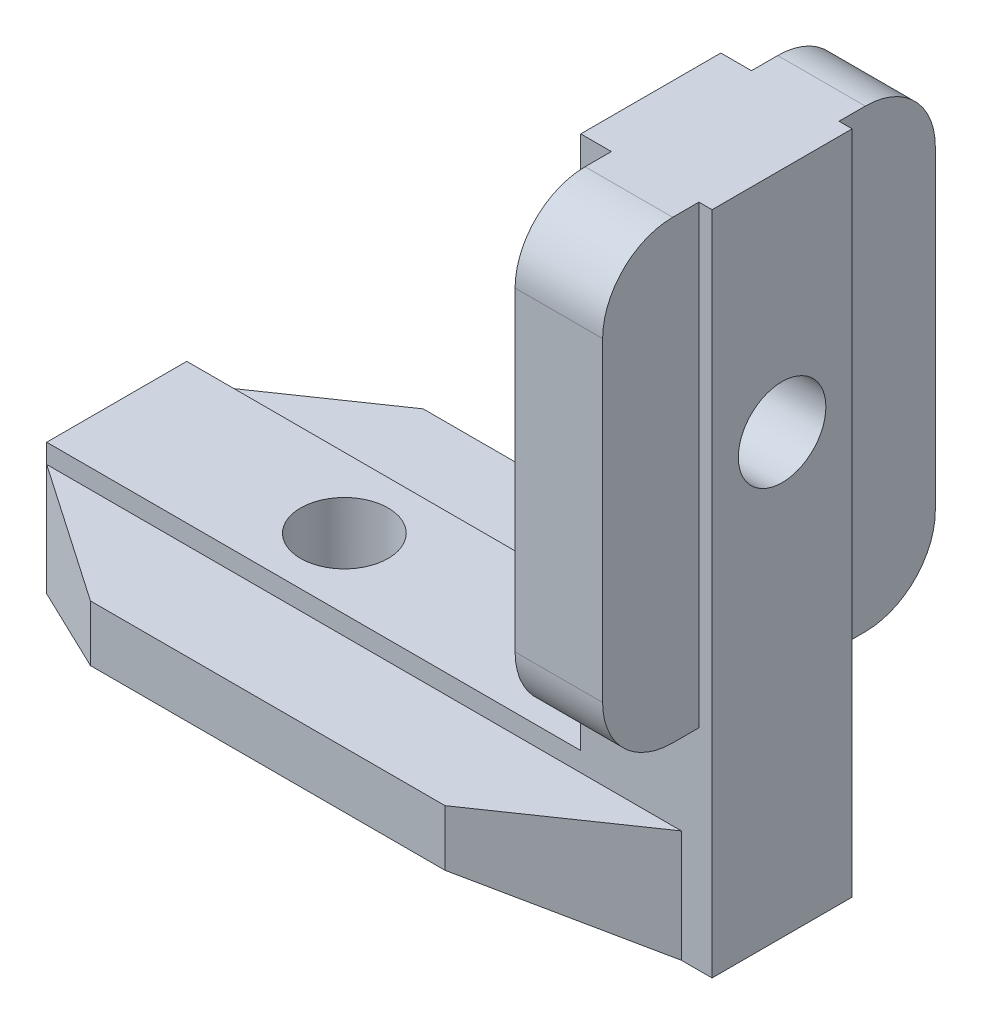
ISO-10303-21;
HEADER;
FILE_DESCRIPTION(('STEP AP214'),'2;1');
FILE_NAME('part.step','',(''),(''),'','','');
FILE_SCHEMA(('AUTOMOTIVE_DESIGN { 1 0 10303 214 1 1 1 1 }'));
ENDSEC;
DATA;
#1=APPLICATION_CONTEXT('core data for automotive mechanical design processes');
#2=APPLICATION_PROTOCOL_DEFINITION('international standard','automotive_design',2000,#1);
#3=PRODUCT_CONTEXT('',#1,'mechanical');
#4=PRODUCT('Part','Part','',(#3));
#5=PRODUCT_RELATED_PRODUCT_CATEGORY('part','',(#4));
#6=PRODUCT_DEFINITION_FORMATION('','',#4);
#7=PRODUCT_DEFINITION_CONTEXT('part definition',#1,'design');
#8=PRODUCT_DEFINITION('design','',#6,#7);
#9=PRODUCT_DEFINITION_SHAPE('','',#8);
#10=(LENGTH_UNIT() NAMED_UNIT(*) SI_UNIT(.MILLI.,.METRE.));
#11=(NAMED_UNIT(*) PLANE_ANGLE_UNIT() SI_UNIT($,.RADIAN.));
#12=(NAMED_UNIT(*) SI_UNIT($,.STERADIAN.) SOLID_ANGLE_UNIT());
#13=UNCERTAINTY_MEASURE_WITH_UNIT(LENGTH_MEASURE(1.E-05),#10,'distance_accuracy_value','');
#14=(GEOMETRIC_REPRESENTATION_CONTEXT(3) GLOBAL_UNCERTAINTY_ASSIGNED_CONTEXT((#13)) GLOBAL_UNIT_ASSIGNED_CONTEXT((#10,
#11,#12)) REPRESENTATION_CONTEXT('',''));
#15=CARTESIAN_POINT('',(0.,0.,0.));
#16=DIRECTION('',(0.,0.,1.));
#17=DIRECTION('',(1.,0.,0.));
#18=AXIS2_PLACEMENT_3D('',#15,#16,#17);
#19=CARTESIAN_POINT('',(0.,0.,-4.));
#20=DIRECTION('',(0.,0.,-1.));
#21=DIRECTION('',(-1.,0.,0.));
#22=AXIS2_PLACEMENT_3D('',#19,#20,#21);
#23=PLANE('',#22);
#24=DIRECTION('',(-1.,0.,0.));
#25=VECTOR('',#24,1.);
#26=CARTESIAN_POINT('',(37.25,12.,-4.));
#27=LINE('',#26,#25);
#28=CARTESIAN_POINT('',(37.25,12.,-4.));
#29=VERTEX_POINT('',#28);
#30=CARTESIAN_POINT('',(32.25,12.,-4.));
#31=VERTEX_POINT('',#30);
#32=EDGE_CURVE('E256',#29,#31,#27,.T.);
#33=ORIENTED_EDGE('',*,*,#32,.F.);
#34=DIRECTION('',(0.,1.,0.));
#35=VECTOR('',#34,1.);
#36=CARTESIAN_POINT('',(37.25,38.,-4.));
#37=LINE('',#36,#35);
#38=CARTESIAN_POINT('',(37.25,38.,-4.));
#39=VERTEX_POINT('',#38);
#40=EDGE_CURVE('E248',#29,#39,#37,.T.);
#41=ORIENTED_EDGE('',*,*,#40,.T.);
#42=DIRECTION('',(-1.,0.,0.));
#43=VECTOR('',#42,1.);
#44=CARTESIAN_POINT('',(30.5,38.,-4.));
#45=LINE('',#44,#43);
#46=CARTESIAN_POINT('',(38.,38.,-4.));
#47=VERTEX_POINT('',#46);
#48=EDGE_CURVE('E568',#47,#39,#45,.T.);
#49=ORIENTED_EDGE('',*,*,#48,.F.);
#50=DIRECTION('',(0.,1.,0.));
#51=VECTOR('',#50,1.);
#52=CARTESIAN_POINT('',(38.,38.,-4.));
#53=LINE('',#52,#51);
#54=CARTESIAN_POINT('',(38.,0.,-4.));
#55=VERTEX_POINT('',#54);
#56=EDGE_CURVE('E375',#55,#47,#53,.T.);
#57=ORIENTED_EDGE('',*,*,#56,.F.);
#58=DIRECTION('',(1.,0.,0.));
#59=VECTOR('',#58,1.);
#60=CARTESIAN_POINT('',(38.,0.,-4.));
#61=LINE('',#60,#59);
#62=CARTESIAN_POINT('',(34.53125,0.,-4.));
#63=VERTEX_POINT('',#62);
#64=EDGE_CURVE('E376',#63,#55,#61,.T.);
#65=ORIENTED_EDGE('',*,*,#64,.F.);
#66=DIRECTION('',(0.,1.,0.));
#67=VECTOR('',#66,1.);
#68=CARTESIAN_POINT('',(34.53125,6.4,-4.));
#69=LINE('',#68,#67);
#70=CARTESIAN_POINT('',(34.53125,6.4,-4.));
#71=VERTEX_POINT('',#70);
#72=EDGE_CURVE('E11',#63,#71,#69,.T.);
#73=ORIENTED_EDGE('',*,*,#72,.T.);
#74=DIRECTION('',(-1.,0.,0.));
#75=VECTOR('',#74,1.);
#76=CARTESIAN_POINT('',(36.25,6.4,-4.));
#77=LINE('',#76,#75);
#78=CARTESIAN_POINT('',(0.,6.4,-4.));
#79=VERTEX_POINT('',#78);
#80=EDGE_CURVE('E297',#71,#79,#77,.T.);
#81=ORIENTED_EDGE('',*,*,#80,.T.);
#82=DIRECTION('',(0.,-1.,0.));
#83=VECTOR('',#82,1.);
#84=CARTESIAN_POINT('',(0.,0.,-4.));
#85=LINE('',#84,#83);
#86=CARTESIAN_POINT('',(0.,7.50000000000006,-4.));
#87=VERTEX_POINT('',#86);
#88=EDGE_CURVE('E363',#87,#79,#85,.T.);
#89=ORIENTED_EDGE('',*,*,#88,.F.);
#90=DIRECTION('',(-1.,0.,0.));
#91=VECTOR('',#90,1.);
#92=CARTESIAN_POINT('',(0.,7.50000000000006,-4.));
#93=LINE('',#92,#91);
#94=CARTESIAN_POINT('',(30.5,7.50000000000006,-4.));
#95=VERTEX_POINT('',#94);
#96=EDGE_CURVE('E384',#95,#87,#93,.T.);
#97=ORIENTED_EDGE('',*,*,#96,.F.);
#98=DIRECTION('',(0.,-1.,0.));
#99=VECTOR('',#98,1.);
#100=CARTESIAN_POINT('',(30.5,7.50000000000006,-4.));
#101=LINE('',#100,#99);
#102=CARTESIAN_POINT('',(30.5,38.,-4.));
#103=VERTEX_POINT('',#102);
#104=EDGE_CURVE('E389',#103,#95,#101,.T.);
#105=ORIENTED_EDGE('',*,*,#104,.F.);
#106=CARTESIAN_POINT('',(32.25,38.,-4.));
#107=VERTEX_POINT('',#106);
#108=EDGE_CURVE('E558',#107,#103,#45,.T.);
#109=ORIENTED_EDGE('',*,*,#108,.F.);
#110=DIRECTION('',(0.,1.,0.));
#111=VECTOR('',#110,1.);
#112=CARTESIAN_POINT('',(32.25,38.,-4.));
#113=LINE('',#112,#111);
#114=EDGE_CURVE('E236',#31,#107,#113,.T.);
#115=ORIENTED_EDGE('',*,*,#114,.F.);
#116=EDGE_LOOP('',(#33,#41,#49,#57,#65,#73,#81,#89,#97,#105,#109,#115));
#117=FACE_BOUND('',#116,.T.);
#118=ADVANCED_FACE('F35',(#117),#23,.T.);
#119=CARTESIAN_POINT('',(0.,0.,4.));
#120=DIRECTION('',(0.,0.,-1.));
#121=DIRECTION('',(-1.,0.,0.));
#122=AXIS2_PLACEMENT_3D('',#119,#120,#121);
#123=PLANE('',#122);
#124=DIRECTION('',(-1.,0.,0.));
#125=VECTOR('',#124,1.);
#126=CARTESIAN_POINT('',(30.5,38.,4.));
#127=LINE('',#126,#125);
#128=CARTESIAN_POINT('',(38.,38.,4.));
#129=VERTEX_POINT('',#128);
#130=CARTESIAN_POINT('',(37.25,38.,4.));
#131=VERTEX_POINT('',#130);
#132=EDGE_CURVE('E533',#129,#131,#127,.T.);
#133=ORIENTED_EDGE('',*,*,#132,.T.);
#134=DIRECTION('',(0.,-1.,0.));
#135=VECTOR('',#134,1.);
#136=CARTESIAN_POINT('',(37.25,38.,4.));
#137=LINE('',#136,#135);
#138=CARTESIAN_POINT('',(37.25,12.,4.));
#139=VERTEX_POINT('',#138);
#140=EDGE_CURVE('E60',#131,#139,#137,.T.);
#141=ORIENTED_EDGE('',*,*,#140,.T.);
#142=DIRECTION('',(-1.,0.,0.));
#143=VECTOR('',#142,1.);
#144=CARTESIAN_POINT('',(37.25,12.,4.));
#145=LINE('',#144,#143);
#146=CARTESIAN_POINT('',(32.25,12.,4.));
#147=VERTEX_POINT('',#146);
#148=EDGE_CURVE('E294',#139,#147,#145,.T.);
#149=ORIENTED_EDGE('',*,*,#148,.T.);
#150=DIRECTION('',(0.,-1.,0.));
#151=VECTOR('',#150,1.);
#152=CARTESIAN_POINT('',(32.25,38.,4.));
#153=LINE('',#152,#151);
#154=CARTESIAN_POINT('',(32.25,38.,4.));
#155=VERTEX_POINT('',#154);
#156=EDGE_CURVE('E255',#155,#147,#153,.T.);
#157=ORIENTED_EDGE('',*,*,#156,.F.);
#158=CARTESIAN_POINT('',(30.5,38.,4.));
#159=VERTEX_POINT('',#158);
#160=EDGE_CURVE('E534',#155,#159,#127,.T.);
#161=ORIENTED_EDGE('',*,*,#160,.T.);
#162=DIRECTION('',(0.,-1.,0.));
#163=VECTOR('',#162,1.);
#164=CARTESIAN_POINT('',(30.5,7.50000000000006,4.));
#165=LINE('',#164,#163);
#166=CARTESIAN_POINT('',(30.5,7.50000000000006,4.));
#167=VERTEX_POINT('',#166);
#168=EDGE_CURVE('E531',#159,#167,#165,.T.);
#169=ORIENTED_EDGE('',*,*,#168,.T.);
#170=DIRECTION('',(-1.,0.,0.));
#171=VECTOR('',#170,1.);
#172=CARTESIAN_POINT('',(0.,7.50000000000006,4.));
#173=LINE('',#172,#171);
#174=CARTESIAN_POINT('',(0.,7.50000000000006,4.));
#175=VERTEX_POINT('',#174);
#176=EDGE_CURVE('E419',#167,#175,#173,.T.);
#177=ORIENTED_EDGE('',*,*,#176,.T.);
#178=DIRECTION('',(0.,-1.,0.));
#179=VECTOR('',#178,1.);
#180=CARTESIAN_POINT('',(0.,0.,4.));
#181=LINE('',#180,#179);
#182=CARTESIAN_POINT('',(0.,6.4,4.));
#183=VERTEX_POINT('',#182);
#184=EDGE_CURVE('E393',#175,#183,#181,.T.);
#185=ORIENTED_EDGE('',*,*,#184,.T.);
#186=DIRECTION('',(-1.,0.,0.));
#187=VECTOR('',#186,1.);
#188=CARTESIAN_POINT('',(36.25,6.4,4.));
#189=LINE('',#188,#187);
#190=CARTESIAN_POINT('',(36.25,6.4,4.));
#191=VERTEX_POINT('',#190);
#192=EDGE_CURVE('E398',#191,#183,#189,.T.);
#193=ORIENTED_EDGE('',*,*,#192,.F.);
#194=DIRECTION('',(0.,-1.,0.));
#195=VECTOR('',#194,1.);
#196=CARTESIAN_POINT('',(36.25,0.,4.));
#197=LINE('',#196,#195);
#198=CARTESIAN_POINT('',(36.25,0.,4.));
#199=VERTEX_POINT('',#198);
#200=EDGE_CURVE('E308',#191,#199,#197,.T.);
#201=ORIENTED_EDGE('',*,*,#200,.T.);
#202=DIRECTION('',(1.,0.,0.));
#203=VECTOR('',#202,1.);
#204=CARTESIAN_POINT('',(38.,0.,4.));
#205=LINE('',#204,#203);
#206=CARTESIAN_POINT('',(38.,0.,4.));
#207=VERTEX_POINT('',#206);
#208=EDGE_CURVE('E397',#199,#207,#205,.T.);
#209=ORIENTED_EDGE('',*,*,#208,.T.);
#210=DIRECTION('',(0.,1.,0.));
#211=VECTOR('',#210,1.);
#212=CARTESIAN_POINT('',(38.,38.,4.));
#213=LINE('',#212,#211);
#214=EDGE_CURVE('E406',#207,#129,#213,.T.);
#215=ORIENTED_EDGE('',*,*,#214,.T.);
#216=EDGE_LOOP('',(#133,#141,#149,#157,#161,#169,#177,#185,#193,#201,#209,#215));
#217=FACE_BOUND('',#216,.T.);
#218=ADVANCED_FACE('F460',(#217),#123,.F.);
#219=CARTESIAN_POINT('',(0.,0.,-4.));
#220=DIRECTION('',(-1.,0.,0.));
#221=DIRECTION('',(0.,0.,1.));
#222=AXIS2_PLACEMENT_3D('',#219,#220,#221);
#223=PLANE('',#222);
#224=ORIENTED_EDGE('',*,*,#88,.T.);
#225=DIRECTION('',(0.,-1.,0.));
#226=VECTOR('',#225,1.);
#227=CARTESIAN_POINT('',(0.,0.,-3.99999999999998));
#228=LINE('',#227,#226);
#229=CARTESIAN_POINT('',(0.,0.,-4.));
#230=VERTEX_POINT('',#229);
#231=EDGE_CURVE('E44',#79,#230,#228,.T.);
#232=ORIENTED_EDGE('',*,*,#231,.T.);
#233=DIRECTION('',(0.,0.,1.));
#234=VECTOR('',#233,1.);
#235=CARTESIAN_POINT('',(0.,0.,-4.));
#236=LINE('',#235,#234);
#237=CARTESIAN_POINT('',(0.,0.,4.));
#238=VERTEX_POINT('',#237);
#239=EDGE_CURVE('E360',#230,#238,#236,.T.);
#240=ORIENTED_EDGE('',*,*,#239,.T.);
#241=DIRECTION('',(0.,1.,0.));
#242=VECTOR('',#241,1.);
#243=CARTESIAN_POINT('',(0.,0.,3.99999999999998));
#244=LINE('',#243,#242);
#245=EDGE_CURVE('E343',#238,#183,#244,.T.);
#246=ORIENTED_EDGE('',*,*,#245,.T.);
#247=ORIENTED_EDGE('',*,*,#184,.F.);
#248=DIRECTION('',(0.,0.,1.));
#249=VECTOR('',#248,1.);
#250=CARTESIAN_POINT('',(0.,7.50000000000006,-4.));
#251=LINE('',#250,#249);
#252=EDGE_CURVE('E432',#87,#175,#251,.T.);
#253=ORIENTED_EDGE('',*,*,#252,.F.);
#254=EDGE_LOOP('',(#224,#232,#240,#246,#247,#253));
#255=FACE_BOUND('',#254,.T.);
#256=ADVANCED_FACE('F358',(#255),#223,.T.);
#257=CARTESIAN_POINT('',(0.,7.50000000000006,-4.));
#258=DIRECTION('',(0.,1.,0.));
#259=DIRECTION('',(0.,0.,1.));
#260=AXIS2_PLACEMENT_3D('',#257,#258,#259);
#261=PLANE('',#260);
#262=CARTESIAN_POINT('',(13.,7.50000000000006,0.));
#263=DIRECTION('',(0.,1.,0.));
#264=DIRECTION('',(0.,0.,1.));
#265=AXIS2_PLACEMENT_3D('',#262,#263,#264);
#266=CIRCLE('',#265,2.49999999999999);
#267=CARTESIAN_POINT('',(13.,7.50000000000006,2.49999999999999));
#268=VERTEX_POINT('',#267);
#269=EDGE_CURVE('E708',#268,#268,#266,.T.);
#270=ORIENTED_EDGE('',*,*,#269,.F.);
#271=EDGE_LOOP('',(#270));
#272=FACE_BOUND('',#271,.T.);
#273=ORIENTED_EDGE('',*,*,#252,.T.);
#274=ORIENTED_EDGE('',*,*,#176,.F.);
#275=DIRECTION('',(0.,0.,1.));
#276=VECTOR('',#275,1.);
#277=CARTESIAN_POINT('',(30.5,7.50000000000006,-4.));
#278=LINE('',#277,#276);
#279=EDGE_CURVE('E562',#95,#167,#278,.T.);
#280=ORIENTED_EDGE('',*,*,#279,.F.);
#281=ORIENTED_EDGE('',*,*,#96,.T.);
#282=EDGE_LOOP('',(#273,#274,#280,#281));
#283=FACE_BOUND('',#282,.T.);
#284=ADVANCED_FACE('F468',(#272,#283),#261,.T.);
#285=CARTESIAN_POINT('',(30.5,7.50000000000006,-4.));
#286=DIRECTION('',(-1.,0.,0.));
#287=DIRECTION('',(0.,0.,1.));
#288=AXIS2_PLACEMENT_3D('',#285,#286,#287);
#289=PLANE('',#288);
#290=CARTESIAN_POINT('',(30.5,25.,0.));
#291=DIRECTION('',(-1.,0.,0.));
#292=DIRECTION('',(0.,0.,1.));
#293=AXIS2_PLACEMENT_3D('',#290,#291,#292);
#294=CIRCLE('',#293,2.49999999999999);
#295=CARTESIAN_POINT('',(30.5,25.,2.49999999999999));
#296=VERTEX_POINT('',#295);
#297=EDGE_CURVE('E228',#296,#296,#294,.T.);
#298=ORIENTED_EDGE('',*,*,#297,.F.);
#299=EDGE_LOOP('',(#298));
#300=FACE_BOUND('',#299,.T.);
#301=ORIENTED_EDGE('',*,*,#279,.T.);
#302=ORIENTED_EDGE('',*,*,#168,.F.);
#303=DIRECTION('',(0.,0.,1.));
#304=VECTOR('',#303,1.);
#305=CARTESIAN_POINT('',(30.5,38.,-4.));
#306=LINE('',#305,#304);
#307=EDGE_CURVE('E556',#103,#159,#306,.T.);
#308=ORIENTED_EDGE('',*,*,#307,.F.);
#309=ORIENTED_EDGE('',*,*,#104,.T.);
#310=EDGE_LOOP('',(#301,#302,#308,#309));
#311=FACE_BOUND('',#310,.T.);
#312=ADVANCED_FACE('F471',(#300,#311),#289,.T.);
#313=CARTESIAN_POINT('',(30.5,38.,-4.));
#314=DIRECTION('',(0.,1.,0.));
#315=DIRECTION('',(0.,0.,1.));
#316=AXIS2_PLACEMENT_3D('',#313,#314,#315);
#317=PLANE('',#316);
#318=ORIENTED_EDGE('',*,*,#307,.T.);
#319=ORIENTED_EDGE('',*,*,#160,.F.);
#320=DIRECTION('',(0.,0.,-1.));
#321=VECTOR('',#320,1.);
#322=CARTESIAN_POINT('',(32.25,38.,4.));
#323=LINE('',#322,#321);
#324=CARTESIAN_POINT('',(32.25,38.,5.49999999999997));
#325=VERTEX_POINT('',#324);
#326=EDGE_CURVE('E275',#325,#155,#323,.T.);
#327=ORIENTED_EDGE('',*,*,#326,.F.);
#328=DIRECTION('',(-1.,0.,0.));
#329=VECTOR('',#328,1.);
#330=CARTESIAN_POINT('',(37.25,38.,5.49999999999997));
#331=LINE('',#330,#329);
#332=CARTESIAN_POINT('',(37.25,38.,5.49999999999997));
#333=VERTEX_POINT('',#332);
#334=EDGE_CURVE('E295',#333,#325,#331,.T.);
#335=ORIENTED_EDGE('',*,*,#334,.F.);
#336=DIRECTION('',(0.,0.,-1.));
#337=VECTOR('',#336,1.);
#338=CARTESIAN_POINT('',(37.25,38.,4.));
#339=LINE('',#338,#337);
#340=EDGE_CURVE('E291',#333,#131,#339,.T.);
#341=ORIENTED_EDGE('',*,*,#340,.T.);
#342=ORIENTED_EDGE('',*,*,#132,.F.);
#343=DIRECTION('',(0.,0.,1.));
#344=VECTOR('',#343,1.);
#345=CARTESIAN_POINT('',(38.,38.,-4.));
#346=LINE('',#345,#344);
#347=EDGE_CURVE('E386',#47,#129,#346,.T.);
#348=ORIENTED_EDGE('',*,*,#347,.F.);
#349=ORIENTED_EDGE('',*,*,#48,.T.);
#350=DIRECTION('',(0.,0.,-1.));
#351=VECTOR('',#350,1.);
#352=CARTESIAN_POINT('',(37.25,38.,-4.));
#353=LINE('',#352,#351);
#354=CARTESIAN_POINT('',(37.25,38.,-5.49999999999997));
#355=VERTEX_POINT('',#354);
#356=EDGE_CURVE('E214',#39,#355,#353,.T.);
#357=ORIENTED_EDGE('',*,*,#356,.T.);
#358=DIRECTION('',(-1.,0.,0.));
#359=VECTOR('',#358,1.);
#360=CARTESIAN_POINT('',(37.25,38.,-5.49999999999997));
#361=LINE('',#360,#359);
#362=CARTESIAN_POINT('',(32.25,38.,-5.49999999999997));
#363=VERTEX_POINT('',#362);
#364=EDGE_CURVE('E253',#355,#363,#361,.T.);
#365=ORIENTED_EDGE('',*,*,#364,.T.);
#366=DIRECTION('',(0.,0.,-1.));
#367=VECTOR('',#366,1.);
#368=CARTESIAN_POINT('',(32.25,38.,-4.));
#369=LINE('',#368,#367);
#370=EDGE_CURVE('E52',#107,#363,#369,.T.);
#371=ORIENTED_EDGE('',*,*,#370,.F.);
#372=ORIENTED_EDGE('',*,*,#108,.T.);
#373=EDGE_LOOP('',(#318,#319,#327,#335,#341,#342,#348,#349,#357,#365,#371,#372));
#374=FACE_BOUND('',#373,.T.);
#375=ADVANCED_FACE('F475',(#374),#317,.T.);
#376=CARTESIAN_POINT('',(38.,38.,-4.));
#377=DIRECTION('',(1.,0.,0.));
#378=DIRECTION('',(0.,0.,-1.));
#379=AXIS2_PLACEMENT_3D('',#376,#377,#378);
#380=PLANE('',#379);
#381=CARTESIAN_POINT('',(38.,25.,0.));
#382=DIRECTION('',(1.,0.,0.));
#383=DIRECTION('',(0.,0.,-1.));
#384=AXIS2_PLACEMENT_3D('',#381,#382,#383);
#385=CIRCLE('',#384,2.49999999999999);
#386=CARTESIAN_POINT('',(38.,25.,-2.49999999999999));
#387=VERTEX_POINT('',#386);
#388=EDGE_CURVE('E225',#387,#387,#385,.T.);
#389=ORIENTED_EDGE('',*,*,#388,.F.);
#390=EDGE_LOOP('',(#389));
#391=FACE_BOUND('',#390,.T.);
#392=ORIENTED_EDGE('',*,*,#347,.T.);
#393=ORIENTED_EDGE('',*,*,#214,.F.);
#394=DIRECTION('',(0.,0.,1.));
#395=VECTOR('',#394,1.);
#396=CARTESIAN_POINT('',(38.,0.,-4.));
#397=LINE('',#396,#395);
#398=EDGE_CURVE('E383',#55,#207,#397,.T.);
#399=ORIENTED_EDGE('',*,*,#398,.F.);
#400=ORIENTED_EDGE('',*,*,#56,.T.);
#401=EDGE_LOOP('',(#392,#393,#399,#400));
#402=FACE_BOUND('',#401,.T.);
#403=ADVANCED_FACE('F479',(#391,#402),#380,.T.);
#404=CARTESIAN_POINT('',(38.,0.,-4.));
#405=DIRECTION('',(0.,-1.,0.));
#406=DIRECTION('',(0.,0.,-1.));
#407=AXIS2_PLACEMENT_3D('',#404,#405,#406);
#408=PLANE('',#407);
#409=CARTESIAN_POINT('',(13.,0.,0.));
#410=DIRECTION('',(0.,-1.,0.));
#411=DIRECTION('',(0.,0.,-1.));
#412=AXIS2_PLACEMENT_3D('',#409,#410,#411);
#413=CIRCLE('',#412,2.49999999999999);
#414=CARTESIAN_POINT('',(13.,0.,-2.49999999999999));
#415=VERTEX_POINT('',#414);
#416=EDGE_CURVE('E39',#415,#415,#413,.T.);
#417=ORIENTED_EDGE('',*,*,#416,.F.);
#418=EDGE_LOOP('',(#417));
#419=FACE_BOUND('',#418,.T.);
#420=ORIENTED_EDGE('',*,*,#398,.T.);
#421=ORIENTED_EDGE('',*,*,#208,.F.);
#422=EDGE_CURVE('E381',#238,#199,#205,.T.);
#423=ORIENTED_EDGE('',*,*,#422,.F.);
#424=ORIENTED_EDGE('',*,*,#239,.F.);
#425=EDGE_CURVE('E369',#230,#63,#61,.T.);
#426=ORIENTED_EDGE('',*,*,#425,.T.);
#427=ORIENTED_EDGE('',*,*,#64,.T.);
#428=EDGE_LOOP('',(#420,#421,#423,#424,#426,#427));
#429=FACE_BOUND('',#428,.T.);
#430=ADVANCED_FACE('F379',(#419,#429),#408,.T.);
#431=CARTESIAN_POINT('',(36.25,6.4,4.));
#432=DIRECTION('',(0.,1.,0.));
#433=DIRECTION('',(0.,0.,1.));
#434=AXIS2_PLACEMENT_3D('',#431,#432,#433);
#435=PLANE('',#434);
#436=DIRECTION('',(-1.,0.,0.));
#437=VECTOR('',#436,1.);
#438=CARTESIAN_POINT('',(36.25,6.4,9.5));
#439=LINE('',#438,#437);
#440=CARTESIAN_POINT('',(28.25,6.4,9.5));
#441=VERTEX_POINT('',#440);
#442=CARTESIAN_POINT('',(8.00000000000005,6.4,9.5));
#443=VERTEX_POINT('',#442);
#444=EDGE_CURVE('E414',#441,#443,#439,.T.);
#445=ORIENTED_EDGE('',*,*,#444,.F.);
#446=DIRECTION('',(-0.824041924199368,0.,0.566528822887065));
#447=VECTOR('',#446,1.);
#448=CARTESIAN_POINT('',(36.25,6.4,4.));
#449=LINE('',#448,#447);
#450=EDGE_CURVE('E335',#441,#191,#449,.F.);
#451=ORIENTED_EDGE('',*,*,#450,.T.);
#452=ORIENTED_EDGE('',*,*,#192,.T.);
#453=DIRECTION('',(-0.824041924199368,0.,-0.566528822887064));
#454=VECTOR('',#453,1.);
#455=CARTESIAN_POINT('',(24.6153846153847,6.4,20.9230769230769));
#456=LINE('',#455,#454);
#457=EDGE_CURVE('E333',#183,#443,#456,.F.);
#458=ORIENTED_EDGE('',*,*,#457,.T.);
#459=EDGE_LOOP('',(#445,#451,#452,#458));
#460=FACE_BOUND('',#459,.T.);
#461=ADVANCED_FACE('F485',(#460),#435,.T.);
#462=CARTESIAN_POINT('',(36.25,6.4,9.5));
#463=DIRECTION('',(0.,0.,1.));
#464=DIRECTION('',(1.,0.,0.));
#465=AXIS2_PLACEMENT_3D('',#462,#463,#464);
#466=PLANE('',#465);
#467=DIRECTION('',(-1.,0.,0.));
#468=VECTOR('',#467,1.);
#469=CARTESIAN_POINT('',(36.25,3.2,9.5));
#470=LINE('',#469,#468);
#471=CARTESIAN_POINT('',(28.25,3.2,9.5));
#472=VERTEX_POINT('',#471);
#473=CARTESIAN_POINT('',(8.00000000000006,3.2,9.5));
#474=VERTEX_POINT('',#473);
#475=EDGE_CURVE('E403',#472,#474,#470,.T.);
#476=ORIENTED_EDGE('',*,*,#475,.F.);
#477=DIRECTION('',(0.,1.,0.));
#478=VECTOR('',#477,1.);
#479=CARTESIAN_POINT('',(28.25,6.4,9.5));
#480=LINE('',#479,#478);
#481=EDGE_CURVE('E330',#472,#441,#480,.T.);
#482=ORIENTED_EDGE('',*,*,#481,.T.);
#483=ORIENTED_EDGE('',*,*,#444,.T.);
#484=DIRECTION('',(0.,-1.,0.));
#485=VECTOR('',#484,1.);
#486=CARTESIAN_POINT('',(8.00000000000005,6.4,9.5));
#487=LINE('',#486,#485);
#488=EDGE_CURVE('E328',#443,#474,#487,.T.);
#489=ORIENTED_EDGE('',*,*,#488,.T.);
#490=EDGE_LOOP('',(#476,#482,#483,#489));
#491=FACE_BOUND('',#490,.T.);
#492=ADVANCED_FACE('F505',(#491),#466,.T.);
#493=CARTESIAN_POINT('',(36.25,3.2,9.5));
#494=DIRECTION('',(0.,-0.864348337709377,0.502893578303638));
#495=DIRECTION('',(0.,-0.502893578303638,-0.864348337709377));
#496=AXIS2_PLACEMENT_3D('',#493,#494,#495);
#497=PLANE('',#496);
#498=ORIENTED_EDGE('',*,*,#422,.T.);
#499=DIRECTION('',(0.782623027844999,-0.313049211138,-0.538053331643437));
#500=VECTOR('',#499,1.);
#501=CARTESIAN_POINT('',(33.1499904297062,1.24000382811752,6.13125657957699));
#502=LINE('',#501,#500);
#503=EDGE_CURVE('E341',#199,#472,#502,.F.);
#504=ORIENTED_EDGE('',*,*,#503,.T.);
#505=ORIENTED_EDGE('',*,*,#475,.T.);
#506=DIRECTION('',(0.782623027845,0.313049211137999,0.538053331643436));
#507=VECTOR('',#506,1.);
#508=CARTESIAN_POINT('',(25.3030912049,10.12123648196,21.3958752033687));
#509=LINE('',#508,#507);
#510=EDGE_CURVE('E339',#474,#238,#509,.F.);
#511=ORIENTED_EDGE('',*,*,#510,.T.);
#512=EDGE_LOOP('',(#498,#504,#505,#511));
#513=FACE_BOUND('',#512,.T.);
#514=ADVANCED_FACE('F502',(#513),#497,.T.);
#515=CARTESIAN_POINT('',(36.25,3.2,-9.5));
#516=DIRECTION('',(0.,-0.864348337709377,-0.502893578303638));
#517=DIRECTION('',(0.,0.502893578303638,-0.864348337709377));
#518=AXIS2_PLACEMENT_3D('',#515,#516,#517);
#519=PLANE('',#518);
#520=DIRECTION('',(-1.,0.,0.));
#521=VECTOR('',#520,1.);
#522=CARTESIAN_POINT('',(36.25,3.2,-9.5));
#523=LINE('',#522,#521);
#524=CARTESIAN_POINT('',(30.75,3.2,-9.5));
#525=VERTEX_POINT('',#524);
#526=CARTESIAN_POINT('',(8.00000000000005,3.2,-9.5));
#527=VERTEX_POINT('',#526);
#528=EDGE_CURVE('E305',#525,#527,#523,.T.);
#529=ORIENTED_EDGE('',*,*,#528,.F.);
#530=DIRECTION('',(0.510849834209104,-0.432322504322415,0.743054304304151));
#531=VECTOR('',#530,1.);
#532=CARTESIAN_POINT('',(32.1853215421131,1.98531466188116,-7.41225957510825));
#533=LINE('',#532,#531);
#534=EDGE_CURVE('E320',#525,#63,#533,.T.);
#535=ORIENTED_EDGE('',*,*,#534,.T.);
#536=ORIENTED_EDGE('',*,*,#425,.F.);
#537=DIRECTION('',(-0.782623027845,-0.313049211137999,0.538053331643436));
#538=VECTOR('',#537,1.);
#539=CARTESIAN_POINT('',(25.3030912049,10.12123648196,-21.3958752033687));
#540=LINE('',#539,#538);
#541=EDGE_CURVE('E372',#230,#527,#540,.F.);
#542=ORIENTED_EDGE('',*,*,#541,.T.);
#543=EDGE_LOOP('',(#529,#535,#536,#542));
#544=FACE_BOUND('',#543,.T.);
#545=ADVANCED_FACE('F371',(#544),#519,.T.);
#546=CARTESIAN_POINT('',(36.25,6.4,-9.5));
#547=DIRECTION('',(0.,0.,-1.));
#548=DIRECTION('',(-1.,0.,0.));
#549=AXIS2_PLACEMENT_3D('',#546,#547,#548);
#550=PLANE('',#549);
#551=DIRECTION('',(-1.,0.,0.));
#552=VECTOR('',#551,1.);
#553=CARTESIAN_POINT('',(36.25,6.4,-9.5));
#554=LINE('',#553,#552);
#555=CARTESIAN_POINT('',(30.75,6.4,-9.5));
#556=VERTEX_POINT('',#555);
#557=CARTESIAN_POINT('',(8.00000000000006,6.4,-9.5));
#558=VERTEX_POINT('',#557);
#559=EDGE_CURVE('E309',#556,#558,#554,.T.);
#560=ORIENTED_EDGE('',*,*,#559,.F.);
#561=DIRECTION('',(0.,-1.,0.));
#562=VECTOR('',#561,1.);
#563=CARTESIAN_POINT('',(30.75,3.2,-9.5));
#564=LINE('',#563,#562);
#565=EDGE_CURVE('E431',#556,#525,#564,.T.);
#566=ORIENTED_EDGE('',*,*,#565,.T.);
#567=ORIENTED_EDGE('',*,*,#528,.T.);
#568=DIRECTION('',(0.,1.,0.));
#569=VECTOR('',#568,1.);
#570=CARTESIAN_POINT('',(8.00000000000005,6.4,-9.5));
#571=LINE('',#570,#569);
#572=EDGE_CURVE('E429',#527,#558,#571,.T.);
#573=ORIENTED_EDGE('',*,*,#572,.T.);
#574=EDGE_LOOP('',(#560,#566,#567,#573));
#575=FACE_BOUND('',#574,.T.);
#576=ADVANCED_FACE('F437',(#575),#550,.T.);
#577=CARTESIAN_POINT('',(36.25,6.4,-4.));
#578=DIRECTION('',(0.,1.,0.));
#579=DIRECTION('',(0.,0.,1.));
#580=AXIS2_PLACEMENT_3D('',#577,#578,#579);
#581=PLANE('',#580);
#582=ORIENTED_EDGE('',*,*,#80,.F.);
#583=DIRECTION('',(-0.566528822887065,0.,-0.824041924199368));
#584=VECTOR('',#583,1.);
#585=CARTESIAN_POINT('',(35.0828912466843,6.4,-3.19761273209549));
#586=LINE('',#585,#584);
#587=EDGE_CURVE('E324',#71,#556,#586,.T.);
#588=ORIENTED_EDGE('',*,*,#587,.T.);
#589=ORIENTED_EDGE('',*,*,#559,.T.);
#590=DIRECTION('',(0.824041924199368,0.,-0.566528822887064));
#591=VECTOR('',#590,1.);
#592=CARTESIAN_POINT('',(24.6153846153847,6.4,-20.9230769230769));
#593=LINE('',#592,#591);
#594=EDGE_CURVE('E322',#558,#79,#593,.F.);
#595=ORIENTED_EDGE('',*,*,#594,.T.);
#596=EDGE_LOOP('',(#582,#588,#589,#595));
#597=FACE_BOUND('',#596,.T.);
#598=ADVANCED_FACE('F447',(#597),#581,.T.);
#599=CARTESIAN_POINT('',(30.75,6.4,-9.5));
#600=DIRECTION('',(0.824041924199368,0.,-0.566528822887065));
#601=DIRECTION('',(0.,1.,0.));
#602=AXIS2_PLACEMENT_3D('',#599,#600,#601);
#603=PLANE('',#602);
#604=ORIENTED_EDGE('',*,*,#587,.F.);
#605=ORIENTED_EDGE('',*,*,#72,.F.);
#606=ORIENTED_EDGE('',*,*,#534,.F.);
#607=ORIENTED_EDGE('',*,*,#565,.F.);
#608=EDGE_LOOP('',(#604,#605,#606,#607));
#609=FACE_BOUND('',#608,.T.);
#610=ADVANCED_FACE('F441',(#609),#603,.T.);
#611=CARTESIAN_POINT('',(28.25,6.4,9.5));
#612=DIRECTION('',(-0.566528822887065,0.,-0.824041924199368));
#613=DIRECTION('',(0.,1.,0.));
#614=AXIS2_PLACEMENT_3D('',#611,#612,#613);
#615=PLANE('',#614);
#616=ORIENTED_EDGE('',*,*,#503,.F.);
#617=ORIENTED_EDGE('',*,*,#200,.F.);
#618=ORIENTED_EDGE('',*,*,#450,.F.);
#619=ORIENTED_EDGE('',*,*,#481,.F.);
#620=EDGE_LOOP('',(#616,#617,#618,#619));
#621=FACE_BOUND('',#620,.T.);
#622=ADVANCED_FACE('F450',(#621),#615,.F.);
#623=CARTESIAN_POINT('',(0.,0.,-3.99999999999998));
#624=DIRECTION('',(0.566528822887064,0.,0.824041924199368));
#625=DIRECTION('',(0.,-1.,0.));
#626=AXIS2_PLACEMENT_3D('',#623,#624,#625);
#627=PLANE('',#626);
#628=ORIENTED_EDGE('',*,*,#594,.F.);
#629=ORIENTED_EDGE('',*,*,#572,.F.);
#630=ORIENTED_EDGE('',*,*,#541,.F.);
#631=ORIENTED_EDGE('',*,*,#231,.F.);
#632=EDGE_LOOP('',(#628,#629,#630,#631));
#633=FACE_BOUND('',#632,.T.);
#634=ADVANCED_FACE('F448',(#633),#627,.F.);
#635=CARTESIAN_POINT('',(0.,0.,3.99999999999998));
#636=DIRECTION('',(0.566528822887064,0.,-0.824041924199368));
#637=DIRECTION('',(0.,1.,0.));
#638=AXIS2_PLACEMENT_3D('',#635,#636,#637);
#639=PLANE('',#638);
#640=ORIENTED_EDGE('',*,*,#510,.F.);
#641=ORIENTED_EDGE('',*,*,#488,.F.);
#642=ORIENTED_EDGE('',*,*,#457,.F.);
#643=ORIENTED_EDGE('',*,*,#245,.F.);
#644=EDGE_LOOP('',(#640,#641,#642,#643));
#645=FACE_BOUND('',#644,.T.);
#646=ADVANCED_FACE('F37',(#645),#639,.F.);
#647=CARTESIAN_POINT('',(37.25,34.,5.5));
#648=DIRECTION('',(-1.,0.,0.));
#649=DIRECTION('',(0.,0.,1.));
#650=AXIS2_PLACEMENT_3D('',#647,#648,#649);
#651=CYLINDRICAL_SURFACE('',#650,4.);
#652=ORIENTED_EDGE('',*,*,#334,.T.);
#653=CARTESIAN_POINT('',(32.25,34.,5.5));
#654=DIRECTION('',(-1.,0.,0.));
#655=DIRECTION('',(0.,0.,-1.));
#656=AXIS2_PLACEMENT_3D('',#653,#654,#655);
#657=CIRCLE('',#656,4.);
#658=CARTESIAN_POINT('',(32.25,34.,9.5));
#659=VERTEX_POINT('',#658);
#660=EDGE_CURVE('E272',#659,#325,#657,.T.);
#661=ORIENTED_EDGE('',*,*,#660,.F.);
#662=DIRECTION('',(-1.,0.,0.));
#663=VECTOR('',#662,1.);
#664=CARTESIAN_POINT('',(37.25,34.,9.5));
#665=LINE('',#664,#663);
#666=CARTESIAN_POINT('',(37.25,34.,9.5));
#667=VERTEX_POINT('',#666);
#668=EDGE_CURVE('E298',#667,#659,#665,.T.);
#669=ORIENTED_EDGE('',*,*,#668,.F.);
#670=CARTESIAN_POINT('',(37.25,34.,5.5));
#671=DIRECTION('',(-1.,0.,0.));
#672=DIRECTION('',(0.,0.,-1.));
#673=AXIS2_PLACEMENT_3D('',#670,#671,#672);
#674=CIRCLE('',#673,4.);
#675=EDGE_CURVE('E288',#667,#333,#674,.T.);
#676=ORIENTED_EDGE('',*,*,#675,.T.);
#677=EDGE_LOOP('',(#652,#661,#669,#676));
#678=FACE_BOUND('',#677,.T.);
#679=ADVANCED_FACE('F455',(#678),#651,.T.);
#680=CARTESIAN_POINT('',(37.25,34.,9.5));
#681=DIRECTION('',(0.,0.,1.));
#682=DIRECTION('',(0.,-1.,0.));
#683=AXIS2_PLACEMENT_3D('',#680,#681,#682);
#684=PLANE('',#683);
#685=ORIENTED_EDGE('',*,*,#668,.T.);
#686=DIRECTION('',(0.,1.,0.));
#687=VECTOR('',#686,1.);
#688=CARTESIAN_POINT('',(32.25,34.,9.5));
#689=LINE('',#688,#687);
#690=CARTESIAN_POINT('',(32.25,16.,9.5));
#691=VERTEX_POINT('',#690);
#692=EDGE_CURVE('E269',#691,#659,#689,.T.);
#693=ORIENTED_EDGE('',*,*,#692,.F.);
#694=DIRECTION('',(-1.,0.,0.));
#695=VECTOR('',#694,1.);
#696=CARTESIAN_POINT('',(37.25,16.,9.5));
#697=LINE('',#696,#695);
#698=CARTESIAN_POINT('',(37.25,16.,9.5));
#699=VERTEX_POINT('',#698);
#700=EDGE_CURVE('E300',#699,#691,#697,.T.);
#701=ORIENTED_EDGE('',*,*,#700,.F.);
#702=DIRECTION('',(0.,1.,0.));
#703=VECTOR('',#702,1.);
#704=CARTESIAN_POINT('',(37.25,34.,9.5));
#705=LINE('',#704,#703);
#706=EDGE_CURVE('E285',#699,#667,#705,.T.);
#707=ORIENTED_EDGE('',*,*,#706,.T.);
#708=EDGE_LOOP('',(#685,#693,#701,#707));
#709=FACE_BOUND('',#708,.T.);
#710=ADVANCED_FACE('F598',(#709),#684,.T.);
#711=CARTESIAN_POINT('',(37.25,16.,5.5));
#712=DIRECTION('',(-1.,0.,0.));
#713=DIRECTION('',(0.,0.,1.));
#714=AXIS2_PLACEMENT_3D('',#711,#712,#713);
#715=CYLINDRICAL_SURFACE('',#714,4.);
#716=ORIENTED_EDGE('',*,*,#700,.T.);
#717=CARTESIAN_POINT('',(32.25,16.,5.5));
#718=DIRECTION('',(-1.,0.,0.));
#719=DIRECTION('',(0.,0.,-1.));
#720=AXIS2_PLACEMENT_3D('',#717,#718,#719);
#721=CIRCLE('',#720,4.);
#722=CARTESIAN_POINT('',(32.25,12.,5.49999999999997));
#723=VERTEX_POINT('',#722);
#724=EDGE_CURVE('E266',#723,#691,#721,.T.);
#725=ORIENTED_EDGE('',*,*,#724,.F.);
#726=DIRECTION('',(-1.,0.,0.));
#727=VECTOR('',#726,1.);
#728=CARTESIAN_POINT('',(37.25,12.,5.49999999999997));
#729=LINE('',#728,#727);
#730=CARTESIAN_POINT('',(37.25,12.,5.49999999999997));
#731=VERTEX_POINT('',#730);
#732=EDGE_CURVE('E302',#731,#723,#729,.T.);
#733=ORIENTED_EDGE('',*,*,#732,.F.);
#734=CARTESIAN_POINT('',(37.25,16.,5.5));
#735=DIRECTION('',(-1.,0.,0.));
#736=DIRECTION('',(0.,0.,-1.));
#737=AXIS2_PLACEMENT_3D('',#734,#735,#736);
#738=CIRCLE('',#737,4.);
#739=EDGE_CURVE('E282',#731,#699,#738,.T.);
#740=ORIENTED_EDGE('',*,*,#739,.T.);
#741=EDGE_LOOP('',(#716,#725,#733,#740));
#742=FACE_BOUND('',#741,.T.);
#743=ADVANCED_FACE('F602',(#742),#715,.T.);
#744=CARTESIAN_POINT('',(37.25,12.,4.));
#745=DIRECTION('',(0.,-1.,0.));
#746=DIRECTION('',(0.,0.,-1.));
#747=AXIS2_PLACEMENT_3D('',#744,#745,#746);
#748=PLANE('',#747);
#749=ORIENTED_EDGE('',*,*,#732,.T.);
#750=DIRECTION('',(0.,0.,1.));
#751=VECTOR('',#750,1.);
#752=CARTESIAN_POINT('',(32.25,12.,4.));
#753=LINE('',#752,#751);
#754=EDGE_CURVE('E263',#147,#723,#753,.T.);
#755=ORIENTED_EDGE('',*,*,#754,.F.);
#756=ORIENTED_EDGE('',*,*,#148,.F.);
#757=DIRECTION('',(0.,0.,1.));
#758=VECTOR('',#757,1.);
#759=CARTESIAN_POINT('',(37.25,12.,4.));
#760=LINE('',#759,#758);
#761=EDGE_CURVE('E279',#139,#731,#760,.T.);
#762=ORIENTED_EDGE('',*,*,#761,.T.);
#763=EDGE_LOOP('',(#749,#755,#756,#762));
#764=FACE_BOUND('',#763,.T.);
#765=ADVANCED_FACE('F550',(#764),#748,.T.);
#766=CARTESIAN_POINT('',(37.25,16.,5.5));
#767=DIRECTION('',(1.,0.,0.));
#768=DIRECTION('',(0.,0.,-1.));
#769=AXIS2_PLACEMENT_3D('',#766,#767,#768);
#770=PLANE('',#769);
#771=ORIENTED_EDGE('',*,*,#140,.F.);
#772=ORIENTED_EDGE('',*,*,#340,.F.);
#773=ORIENTED_EDGE('',*,*,#675,.F.);
#774=ORIENTED_EDGE('',*,*,#706,.F.);
#775=ORIENTED_EDGE('',*,*,#739,.F.);
#776=ORIENTED_EDGE('',*,*,#761,.F.);
#777=EDGE_LOOP('',(#771,#772,#773,#774,#775,#776));
#778=FACE_BOUND('',#777,.T.);
#779=ADVANCED_FACE('F545',(#778),#770,.T.);
#780=CARTESIAN_POINT('',(32.25,16.,5.5));
#781=DIRECTION('',(1.,0.,0.));
#782=DIRECTION('',(0.,0.,-1.));
#783=AXIS2_PLACEMENT_3D('',#780,#781,#782);
#784=PLANE('',#783);
#785=ORIENTED_EDGE('',*,*,#156,.T.);
#786=ORIENTED_EDGE('',*,*,#754,.T.);
#787=ORIENTED_EDGE('',*,*,#724,.T.);
#788=ORIENTED_EDGE('',*,*,#692,.T.);
#789=ORIENTED_EDGE('',*,*,#660,.T.);
#790=ORIENTED_EDGE('',*,*,#326,.T.);
#791=EDGE_LOOP('',(#785,#786,#787,#788,#789,#790));
#792=FACE_BOUND('',#791,.T.);
#793=ADVANCED_FACE('F553',(#792),#784,.F.);
#794=CARTESIAN_POINT('',(37.25,34.,-5.5));
#795=DIRECTION('',(-1.,0.,0.));
#796=DIRECTION('',(0.,0.,1.));
#797=AXIS2_PLACEMENT_3D('',#794,#795,#796);
#798=CYLINDRICAL_SURFACE('',#797,4.);
#799=DIRECTION('',(-1.,0.,0.));
#800=VECTOR('',#799,1.);
#801=CARTESIAN_POINT('',(37.25,34.,-9.5));
#802=LINE('',#801,#800);
#803=CARTESIAN_POINT('',(37.25,34.,-9.5));
#804=VERTEX_POINT('',#803);
#805=CARTESIAN_POINT('',(32.25,34.,-9.5));
#806=VERTEX_POINT('',#805);
#807=EDGE_CURVE('E203',#804,#806,#802,.T.);
#808=ORIENTED_EDGE('',*,*,#807,.T.);
#809=CARTESIAN_POINT('',(32.25,34.,-5.5));
#810=DIRECTION('',(-1.,0.,0.));
#811=DIRECTION('',(0.,0.,1.));
#812=AXIS2_PLACEMENT_3D('',#809,#810,#811);
#813=CIRCLE('',#812,4.);
#814=EDGE_CURVE('E207',#363,#806,#813,.T.);
#815=ORIENTED_EDGE('',*,*,#814,.F.);
#816=ORIENTED_EDGE('',*,*,#364,.F.);
#817=CARTESIAN_POINT('',(37.25,34.,-5.5));
#818=DIRECTION('',(-1.,0.,0.));
#819=DIRECTION('',(0.,0.,1.));
#820=AXIS2_PLACEMENT_3D('',#817,#818,#819);
#821=CIRCLE('',#820,4.);
#822=EDGE_CURVE('E209',#355,#804,#821,.T.);
#823=ORIENTED_EDGE('',*,*,#822,.T.);
#824=EDGE_LOOP('',(#808,#815,#816,#823));
#825=FACE_BOUND('',#824,.T.);
#826=ADVANCED_FACE('F205',(#825),#798,.T.);
#827=CARTESIAN_POINT('',(37.25,12.,-4.));
#828=DIRECTION('',(0.,-1.,0.));
#829=DIRECTION('',(0.,0.,-1.));
#830=AXIS2_PLACEMENT_3D('',#827,#828,#829);
#831=PLANE('',#830);
#832=ORIENTED_EDGE('',*,*,#32,.T.);
#833=DIRECTION('',(0.,0.,1.));
#834=VECTOR('',#833,1.);
#835=CARTESIAN_POINT('',(32.25,12.,-4.));
#836=LINE('',#835,#834);
#837=CARTESIAN_POINT('',(32.25,12.,-5.49999999999997));
#838=VERTEX_POINT('',#837);
#839=EDGE_CURVE('E233',#838,#31,#836,.T.);
#840=ORIENTED_EDGE('',*,*,#839,.F.);
#841=DIRECTION('',(-1.,0.,0.));
#842=VECTOR('',#841,1.);
#843=CARTESIAN_POINT('',(37.25,12.,-5.49999999999997));
#844=LINE('',#843,#842);
#845=CARTESIAN_POINT('',(37.25,12.,-5.49999999999997));
#846=VERTEX_POINT('',#845);
#847=EDGE_CURVE('E258',#846,#838,#844,.T.);
#848=ORIENTED_EDGE('',*,*,#847,.F.);
#849=DIRECTION('',(0.,0.,1.));
#850=VECTOR('',#849,1.);
#851=CARTESIAN_POINT('',(37.25,12.,-4.));
#852=LINE('',#851,#850);
#853=EDGE_CURVE('E245',#846,#29,#852,.T.);
#854=ORIENTED_EDGE('',*,*,#853,.T.);
#855=EDGE_LOOP('',(#832,#840,#848,#854));
#856=FACE_BOUND('',#855,.T.);
#857=ADVANCED_FACE('F576',(#856),#831,.T.);
#858=CARTESIAN_POINT('',(37.25,16.,-5.5));
#859=DIRECTION('',(-1.,0.,0.));
#860=DIRECTION('',(0.,0.,1.));
#861=AXIS2_PLACEMENT_3D('',#858,#859,#860);
#862=CYLINDRICAL_SURFACE('',#861,4.);
#863=ORIENTED_EDGE('',*,*,#847,.T.);
#864=CARTESIAN_POINT('',(32.25,16.,-5.5));
#865=DIRECTION('',(-1.,0.,0.));
#866=DIRECTION('',(0.,0.,1.));
#867=AXIS2_PLACEMENT_3D('',#864,#865,#866);
#868=CIRCLE('',#867,4.);
#869=CARTESIAN_POINT('',(32.25,16.,-9.5));
#870=VERTEX_POINT('',#869);
#871=EDGE_CURVE('E222',#870,#838,#868,.T.);
#872=ORIENTED_EDGE('',*,*,#871,.F.);
#873=DIRECTION('',(-1.,0.,0.));
#874=VECTOR('',#873,1.);
#875=CARTESIAN_POINT('',(37.25,16.,-9.5));
#876=LINE('',#875,#874);
#877=CARTESIAN_POINT('',(37.25,16.,-9.5));
#878=VERTEX_POINT('',#877);
#879=EDGE_CURVE('E213',#878,#870,#876,.T.);
#880=ORIENTED_EDGE('',*,*,#879,.F.);
#881=CARTESIAN_POINT('',(37.25,16.,-5.5));
#882=DIRECTION('',(-1.,0.,0.));
#883=DIRECTION('',(0.,0.,1.));
#884=AXIS2_PLACEMENT_3D('',#881,#882,#883);
#885=CIRCLE('',#884,4.);
#886=EDGE_CURVE('E242',#878,#846,#885,.T.);
#887=ORIENTED_EDGE('',*,*,#886,.T.);
#888=EDGE_LOOP('',(#863,#872,#880,#887));
#889=FACE_BOUND('',#888,.T.);
#890=ADVANCED_FACE('F579',(#889),#862,.T.);
#891=CARTESIAN_POINT('',(37.25,34.,-9.5));
#892=DIRECTION('',(0.,0.,-1.));
#893=DIRECTION('',(0.,1.,0.));
#894=AXIS2_PLACEMENT_3D('',#891,#892,#893);
#895=PLANE('',#894);
#896=ORIENTED_EDGE('',*,*,#879,.T.);
#897=DIRECTION('',(0.,-1.,0.));
#898=VECTOR('',#897,1.);
#899=CARTESIAN_POINT('',(32.25,34.,-9.5));
#900=LINE('',#899,#898);
#901=EDGE_CURVE('E217',#806,#870,#900,.T.);
#902=ORIENTED_EDGE('',*,*,#901,.F.);
#903=ORIENTED_EDGE('',*,*,#807,.F.);
#904=DIRECTION('',(0.,-1.,0.));
#905=VECTOR('',#904,1.);
#906=CARTESIAN_POINT('',(37.25,34.,-9.5));
#907=LINE('',#906,#905);
#908=EDGE_CURVE('E240',#804,#878,#907,.T.);
#909=ORIENTED_EDGE('',*,*,#908,.T.);
#910=EDGE_LOOP('',(#896,#902,#903,#909));
#911=FACE_BOUND('',#910,.T.);
#912=ADVANCED_FACE('F218',(#911),#895,.T.);
#913=CARTESIAN_POINT('',(37.25,34.,-5.5));
#914=DIRECTION('',(-1.,0.,0.));
#915=DIRECTION('',(0.,0.,1.));
#916=AXIS2_PLACEMENT_3D('',#913,#914,#915);
#917=PLANE('',#916);
#918=ORIENTED_EDGE('',*,*,#822,.F.);
#919=ORIENTED_EDGE('',*,*,#356,.F.);
#920=ORIENTED_EDGE('',*,*,#40,.F.);
#921=ORIENTED_EDGE('',*,*,#853,.F.);
#922=ORIENTED_EDGE('',*,*,#886,.F.);
#923=ORIENTED_EDGE('',*,*,#908,.F.);
#924=EDGE_LOOP('',(#918,#919,#920,#921,#922,#923));
#925=FACE_BOUND('',#924,.T.);
#926=ADVANCED_FACE('F573',(#925),#917,.F.);
#927=CARTESIAN_POINT('',(32.25,34.,-5.5));
#928=DIRECTION('',(-1.,0.,0.));
#929=DIRECTION('',(0.,0.,1.));
#930=AXIS2_PLACEMENT_3D('',#927,#928,#929);
#931=PLANE('',#930);
#932=ORIENTED_EDGE('',*,*,#814,.T.);
#933=ORIENTED_EDGE('',*,*,#901,.T.);
#934=ORIENTED_EDGE('',*,*,#871,.T.);
#935=ORIENTED_EDGE('',*,*,#839,.T.);
#936=ORIENTED_EDGE('',*,*,#114,.T.);
#937=ORIENTED_EDGE('',*,*,#370,.T.);
#938=EDGE_LOOP('',(#932,#933,#934,#935,#936,#937));
#939=FACE_BOUND('',#938,.T.);
#940=ADVANCED_FACE('F224',(#939),#931,.T.);
#941=CARTESIAN_POINT('',(30.5,25.,0.));
#942=DIRECTION('',(-1.,0.,0.));
#943=DIRECTION('',(0.,0.,1.));
#944=AXIS2_PLACEMENT_3D('',#941,#942,#943);
#945=CYLINDRICAL_SURFACE('',#944,2.49999999999999);
#946=ORIENTED_EDGE('',*,*,#388,.T.);
#947=EDGE_LOOP('',(#946));
#948=FACE_BOUND('',#947,.T.);
#949=ORIENTED_EDGE('',*,*,#297,.T.);
#950=EDGE_LOOP('',(#949));
#951=FACE_BOUND('',#950,.T.);
#952=ADVANCED_FACE('F653',(#948,#951),#945,.F.);
#953=CARTESIAN_POINT('',(13.,7.50000000000006,0.));
#954=DIRECTION('',(0.,1.,0.));
#955=DIRECTION('',(0.,0.,1.));
#956=AXIS2_PLACEMENT_3D('',#953,#954,#955);
#957=CYLINDRICAL_SURFACE('',#956,2.49999999999999);
#958=ORIENTED_EDGE('',*,*,#416,.T.);
#959=EDGE_LOOP('',(#958));
#960=FACE_BOUND('',#959,.T.);
#961=ORIENTED_EDGE('',*,*,#269,.T.);
#962=EDGE_LOOP('',(#961));
#963=FACE_BOUND('',#962,.T.);
#964=ADVANCED_FACE('F677',(#960,#963),#957,.F.);
#965=CLOSED_SHELL('',(#118,#218,#256,#284,#312,#375,#403,#430,#461,#492,#514,#545,#576,#598,
#610,#622,#634,#646,#679,#710,#743,#765,#779,#793,#826,#857,#890,#912,#926,#940,#952,#964));
#966=MANIFOLD_SOLID_BREP('B2',#965);
#967=ADVANCED_BREP_SHAPE_REPRESENTATION('',(#18,#966),#14);
#968=SHAPE_DEFINITION_REPRESENTATION(#9,#967);
ENDSEC;
END-ISO-10303-21;
